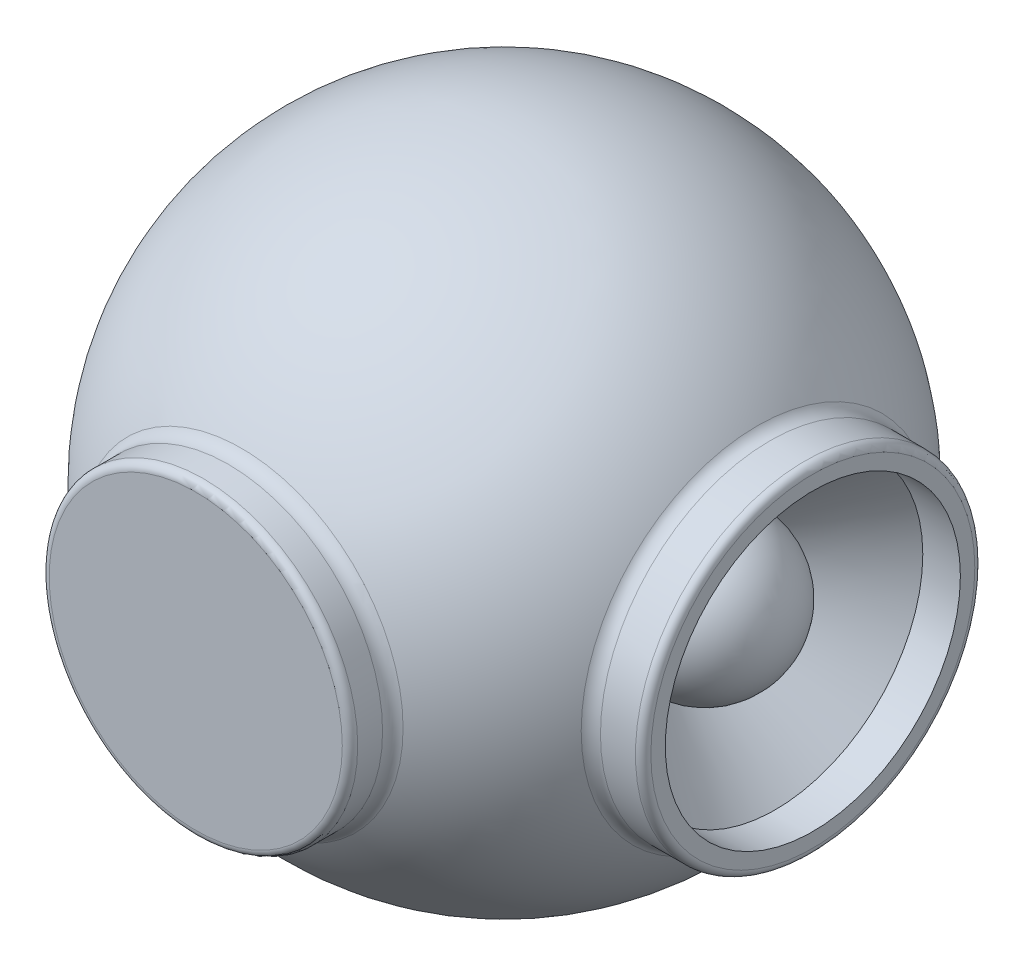
ISO-10303-21;
HEADER;
FILE_DESCRIPTION(('STEP AP214'),'2;1');
FILE_NAME('part.step','',(''),(''),'','','');
FILE_SCHEMA(('AUTOMOTIVE_DESIGN { 1 0 10303 214 1 1 1 1 }'));
ENDSEC;
DATA;
#1=APPLICATION_CONTEXT('core data for automotive mechanical design processes');
#2=APPLICATION_PROTOCOL_DEFINITION('international standard','automotive_design',2000,#1);
#3=PRODUCT_CONTEXT('',#1,'mechanical');
#4=PRODUCT('Part','Part','',(#3));
#5=PRODUCT_RELATED_PRODUCT_CATEGORY('part','',(#4));
#6=PRODUCT_DEFINITION_FORMATION('','',#4);
#7=PRODUCT_DEFINITION_CONTEXT('part definition',#1,'design');
#8=PRODUCT_DEFINITION('design','',#6,#7);
#9=PRODUCT_DEFINITION_SHAPE('','',#8);
#10=(LENGTH_UNIT() NAMED_UNIT(*) SI_UNIT(.MILLI.,.METRE.));
#11=(NAMED_UNIT(*) PLANE_ANGLE_UNIT() SI_UNIT($,.RADIAN.));
#12=(NAMED_UNIT(*) SI_UNIT($,.STERADIAN.) SOLID_ANGLE_UNIT());
#13=UNCERTAINTY_MEASURE_WITH_UNIT(LENGTH_MEASURE(1.E-05),#10,'distance_accuracy_value','');
#14=(GEOMETRIC_REPRESENTATION_CONTEXT(3) GLOBAL_UNCERTAINTY_ASSIGNED_CONTEXT((#13)) GLOBAL_UNIT_ASSIGNED_CONTEXT((#10,
#11,#12)) REPRESENTATION_CONTEXT('',''));
#15=CARTESIAN_POINT('',(0.,0.,0.));
#16=DIRECTION('',(0.,0.,1.));
#17=DIRECTION('',(1.,0.,0.));
#18=AXIS2_PLACEMENT_3D('',#15,#16,#17);
#19=CARTESIAN_POINT('',(13.,0.,0.));
#20=DIRECTION('',(1.,0.,0.));
#21=DIRECTION('',(0.,0.,-1.));
#22=AXIS2_PLACEMENT_3D('',#19,#20,#21);
#23=CONICAL_SURFACE('',#22,4.99999999999991,0.785398163397453);
#24=CARTESIAN_POINT('',(17.5646599662506,0.,0.));
#25=DIRECTION('',(1.,0.,0.));
#26=DIRECTION('',(0.,0.,-1.));
#27=AXIS2_PLACEMENT_3D('',#24,#25,#26);
#28=CIRCLE('',#27,9.56465996625051);
#29=CARTESIAN_POINT('',(17.5646599662506,0.,-9.56465996625051));
#30=VERTEX_POINT('',#29);
#31=EDGE_CURVE('E133',#30,#30,#28,.F.);
#32=ORIENTED_EDGE('',*,*,#31,.F.);
#33=EDGE_LOOP('',(#32));
#34=FACE_BOUND('',#33,.T.);
#35=CARTESIAN_POINT('',(13.,0.,0.));
#36=DIRECTION('',(1.,0.,0.));
#37=DIRECTION('',(0.,0.,-1.));
#38=AXIS2_PLACEMENT_3D('',#35,#36,#37);
#39=CIRCLE('',#38,4.99999999999991);
#40=CARTESIAN_POINT('',(13.,0.,-4.99999999999991));
#41=VERTEX_POINT('',#40);
#42=EDGE_CURVE('E136',#41,#41,#39,.T.);
#43=ORIENTED_EDGE('',*,*,#42,.F.);
#44=EDGE_LOOP('',(#43));
#45=FACE_BOUND('',#44,.T.);
#46=ADVANCED_FACE('F55',(#34,#45),#23,.F.);
#47=CARTESIAN_POINT('',(13.,0.,0.));
#48=DIRECTION('',(0.,-1.,0.));
#49=DIRECTION('',(0.,0.,-1.));
#50=AXIS2_PLACEMENT_3D('',#47,#48,#49);
#51=SPHERICAL_SURFACE('',#50,4.99999999999991);
#52=CARTESIAN_POINT('',(13.,0.,0.));
#53=DIRECTION('',(1.,0.,0.));
#54=DIRECTION('',(0.,0.,-1.));
#55=AXIS2_PLACEMENT_3D('',#52,#53,#54);
#56=SPHERICAL_SURFACE('',#55,4.99999999999991);
#57=ORIENTED_EDGE('',*,*,#42,.T.);
#58=EDGE_LOOP('',(#57));
#59=FACE_BOUND('',#58,.T.);
#60=ADVANCED_FACE('F84',(#59),#56,.T.);
#61=CARTESIAN_POINT('',(20.,0.,0.));
#62=DIRECTION('',(1.,0.,0.));
#63=DIRECTION('',(0.,0.,-1.));
#64=AXIS2_PLACEMENT_3D('',#61,#62,#63);
#65=PLANE('',#64);
#66=CARTESIAN_POINT('',(20.,0.,0.));
#67=DIRECTION('',(1.,0.,0.));
#68=DIRECTION('',(0.,0.,-1.));
#69=AXIS2_PLACEMENT_3D('',#66,#67,#68);
#70=CIRCLE('',#69,10.5);
#71=CARTESIAN_POINT('',(20.,0.,-10.5));
#72=VERTEX_POINT('',#71);
#73=EDGE_CURVE('E114',#72,#72,#70,.T.);
#74=ORIENTED_EDGE('',*,*,#73,.T.);
#75=EDGE_LOOP('',(#74));
#76=FACE_BOUND('',#75,.T.);
#77=CARTESIAN_POINT('',(20.,0.,0.));
#78=DIRECTION('',(1.,0.,0.));
#79=DIRECTION('',(0.,0.,-1.));
#80=AXIS2_PLACEMENT_3D('',#77,#78,#79);
#81=CIRCLE('',#80,9.56465996625051);
#82=CARTESIAN_POINT('',(20.,0.,-9.56465996625051));
#83=VERTEX_POINT('',#82);
#84=EDGE_CURVE('E139',#83,#83,#81,.T.);
#85=ORIENTED_EDGE('',*,*,#84,.F.);
#86=EDGE_LOOP('',(#85));
#87=FACE_BOUND('',#86,.T.);
#88=ADVANCED_FACE('F90',(#76,#87),#65,.T.);
#89=CARTESIAN_POINT('',(-20.002,0.,0.));
#90=DIRECTION('',(1.,0.,0.));
#91=DIRECTION('',(0.,0.,-1.));
#92=AXIS2_PLACEMENT_3D('',#89,#90,#91);
#93=CYLINDRICAL_SURFACE('',#92,11.);
#94=CARTESIAN_POINT('',(19.5,0.,0.));
#95=DIRECTION('',(1.,0.,0.));
#96=DIRECTION('',(0.,0.,-1.));
#97=AXIS2_PLACEMENT_3D('',#94,#95,#96);
#98=CIRCLE('',#97,11.);
#99=CARTESIAN_POINT('',(19.5,0.,-11.));
#100=VERTEX_POINT('',#99);
#101=EDGE_CURVE('E111',#100,#100,#98,.F.);
#102=ORIENTED_EDGE('',*,*,#101,.T.);
#103=EDGE_LOOP('',(#102));
#104=FACE_BOUND('',#103,.T.);
#105=CARTESIAN_POINT('',(17.2336879396141,0.,0.));
#106=DIRECTION('',(-1.,0.,0.));
#107=DIRECTION('',(0.,0.,1.));
#108=AXIS2_PLACEMENT_3D('',#105,#106,#107);
#109=CIRCLE('',#108,11.);
#110=CARTESIAN_POINT('',(17.2336879396141,0.,11.));
#111=VERTEX_POINT('',#110);
#112=EDGE_CURVE('E116',#111,#111,#109,.F.);
#113=ORIENTED_EDGE('',*,*,#112,.T.);
#114=EDGE_LOOP('',(#113));
#115=FACE_BOUND('',#114,.T.);
#116=ADVANCED_FACE('F147',(#104,#115),#93,.T.);
#117=CARTESIAN_POINT('',(-20.002,0.,0.));
#118=DIRECTION('',(1.,0.,0.));
#119=DIRECTION('',(0.,0.,-1.));
#120=AXIS2_PLACEMENT_3D('',#117,#118,#119);
#121=CYLINDRICAL_SURFACE('',#120,9.56465996625051);
#122=ORIENTED_EDGE('',*,*,#84,.T.);
#123=EDGE_LOOP('',(#122));
#124=FACE_BOUND('',#123,.T.);
#125=ORIENTED_EDGE('',*,*,#31,.T.);
#126=EDGE_LOOP('',(#125));
#127=FACE_BOUND('',#126,.T.);
#128=ADVANCED_FACE('F143',(#124,#127),#121,.F.);
#129=CARTESIAN_POINT('',(0.,0.,0.));
#130=DIRECTION('',(0.,0.,-1.));
#131=DIRECTION('',(1.,0.,0.));
#132=AXIS2_PLACEMENT_3D('',#129,#130,#131);
#133=SPHERICAL_SURFACE('',#132,20.);
#134=CARTESIAN_POINT('',(0.,0.,17.0367083999984));
#135=DIRECTION('',(0.,0.,-1.));
#136=DIRECTION('',(-1.,0.,0.));
#137=AXIS2_PLACEMENT_3D('',#134,#135,#136);
#138=CIRCLE('',#137,10.4761904761905);
#139=CARTESIAN_POINT('',(-10.4761904761905,0.,17.0367083999984));
#140=VERTEX_POINT('',#139);
#141=EDGE_CURVE('E120',#140,#140,#138,.T.);
#142=ORIENTED_EDGE('',*,*,#141,.T.);
#143=EDGE_LOOP('',(#142));
#144=FACE_BOUND('',#143,.T.);
#145=CARTESIAN_POINT('',(16.4130361329658,0.,0.));
#146=DIRECTION('',(-1.,0.,0.));
#147=DIRECTION('',(0.,0.,1.));
#148=AXIS2_PLACEMENT_3D('',#145,#146,#147);
#149=CIRCLE('',#148,11.4285714285714);
#150=CARTESIAN_POINT('',(16.4130361329658,0.,11.4285714285714));
#151=VERTEX_POINT('',#150);
#152=EDGE_CURVE('E127',#151,#151,#149,.T.);
#153=ORIENTED_EDGE('',*,*,#152,.T.);
#154=EDGE_LOOP('',(#153));
#155=FACE_BOUND('',#154,.T.);
#156=ADVANCED_FACE('F79',(#144,#155),#133,.T.);
#157=CARTESIAN_POINT('',(0.,0.,-20.002));
#158=DIRECTION('',(0.,0.,1.));
#159=DIRECTION('',(1.,0.,0.));
#160=AXIS2_PLACEMENT_3D('',#157,#158,#159);
#161=CYLINDRICAL_SURFACE('',#160,10.);
#162=CARTESIAN_POINT('',(0.,0.,19.5));
#163=DIRECTION('',(0.,0.,1.));
#164=DIRECTION('',(1.,0.,0.));
#165=AXIS2_PLACEMENT_3D('',#162,#163,#164);
#166=CIRCLE('',#165,10.);
#167=CARTESIAN_POINT('',(10.,0.,19.5));
#168=VERTEX_POINT('',#167);
#169=EDGE_CURVE('E12',#168,#168,#166,.F.);
#170=ORIENTED_EDGE('',*,*,#169,.T.);
#171=EDGE_LOOP('',(#170));
#172=FACE_BOUND('',#171,.T.);
#173=CARTESIAN_POINT('',(0.,0.,17.8885438199983));
#174=DIRECTION('',(0.,0.,-1.));
#175=DIRECTION('',(-1.,0.,0.));
#176=AXIS2_PLACEMENT_3D('',#173,#174,#175);
#177=CIRCLE('',#176,10.);
#178=CARTESIAN_POINT('',(-10.,0.,17.8885438199983));
#179=VERTEX_POINT('',#178);
#180=EDGE_CURVE('E130',#179,#179,#177,.F.);
#181=ORIENTED_EDGE('',*,*,#180,.T.);
#182=EDGE_LOOP('',(#181));
#183=FACE_BOUND('',#182,.T.);
#184=ADVANCED_FACE('F68',(#172,#183),#161,.T.);
#185=CARTESIAN_POINT('',(0.,0.,20.));
#186=DIRECTION('',(0.,0.,1.));
#187=DIRECTION('',(1.,0.,0.));
#188=AXIS2_PLACEMENT_3D('',#185,#186,#187);
#189=PLANE('',#188);
#190=CARTESIAN_POINT('',(0.,0.,20.));
#191=DIRECTION('',(0.,0.,1.));
#192=DIRECTION('',(1.,0.,0.));
#193=AXIS2_PLACEMENT_3D('',#190,#191,#192);
#194=CIRCLE('',#193,9.5);
#195=CARTESIAN_POINT('',(9.5,0.,20.));
#196=VERTEX_POINT('',#195);
#197=EDGE_CURVE('E62',#196,#196,#194,.T.);
#198=ORIENTED_EDGE('',*,*,#197,.T.);
#199=EDGE_LOOP('',(#198));
#200=FACE_BOUND('',#199,.T.);
#201=CARTESIAN_POINT('',(0.,0.,20.));
#202=VERTEX_POINT('',#201);
#203=VERTEX_LOOP('',#202);
#204=FACE_BOUND('',#203,.T.);
#205=ADVANCED_FACE('F65',(#200,#204),#189,.T.);
#206=CARTESIAN_POINT('',(0.,0.,17.8885438199983));
#207=DIRECTION('',(0.,0.,-1.));
#208=DIRECTION('',(-1.,0.,0.));
#209=AXIS2_PLACEMENT_3D('',#206,#207,#208);
#210=TOROIDAL_SURFACE('',#209,11.,1.);
#211=ORIENTED_EDGE('',*,*,#141,.F.);
#212=EDGE_LOOP('',(#211));
#213=FACE_BOUND('',#212,.T.);
#214=ORIENTED_EDGE('',*,*,#180,.F.);
#215=EDGE_LOOP('',(#214));
#216=FACE_BOUND('',#215,.T.);
#217=ADVANCED_FACE('F67',(#213,#216),#210,.F.);
#218=CARTESIAN_POINT('',(17.2336879396141,0.,0.));
#219=DIRECTION('',(-1.,0.,0.));
#220=DIRECTION('',(0.,0.,1.));
#221=AXIS2_PLACEMENT_3D('',#218,#219,#220);
#222=TOROIDAL_SURFACE('',#221,12.,1.);
#223=ORIENTED_EDGE('',*,*,#152,.F.);
#224=EDGE_LOOP('',(#223));
#225=FACE_BOUND('',#224,.T.);
#226=ORIENTED_EDGE('',*,*,#112,.F.);
#227=EDGE_LOOP('',(#226));
#228=FACE_BOUND('',#227,.T.);
#229=ADVANCED_FACE('F76',(#225,#228),#222,.F.);
#230=CARTESIAN_POINT('',(19.5,0.,0.));
#231=DIRECTION('',(1.,0.,0.));
#232=DIRECTION('',(0.,0.,-1.));
#233=AXIS2_PLACEMENT_3D('',#230,#231,#232);
#234=TOROIDAL_SURFACE('',#233,10.5,0.5);
#235=ORIENTED_EDGE('',*,*,#101,.F.);
#236=EDGE_LOOP('',(#235));
#237=FACE_BOUND('',#236,.T.);
#238=ORIENTED_EDGE('',*,*,#73,.F.);
#239=EDGE_LOOP('',(#238));
#240=FACE_BOUND('',#239,.T.);
#241=ADVANCED_FACE('F101',(#237,#240),#234,.T.);
#242=CARTESIAN_POINT('',(0.,0.,19.5));
#243=DIRECTION('',(0.,0.,1.));
#244=DIRECTION('',(1.,0.,0.));
#245=AXIS2_PLACEMENT_3D('',#242,#243,#244);
#246=TOROIDAL_SURFACE('',#245,9.5,0.5);
#247=ORIENTED_EDGE('',*,*,#169,.F.);
#248=EDGE_LOOP('',(#247));
#249=FACE_BOUND('',#248,.T.);
#250=ORIENTED_EDGE('',*,*,#197,.F.);
#251=EDGE_LOOP('',(#250));
#252=FACE_BOUND('',#251,.T.);
#253=ADVANCED_FACE('F57',(#249,#252),#246,.T.);
#254=CLOSED_SHELL('',(#46,#60,#88,#116,#128,#156,#184,#205,#217,#229,#241,#253));
#255=MANIFOLD_SOLID_BREP('B2',#254);
#256=ADVANCED_BREP_SHAPE_REPRESENTATION('',(#18,#255),#14);
#257=SHAPE_DEFINITION_REPRESENTATION(#9,#256);
ENDSEC;
END-ISO-10303-21;
